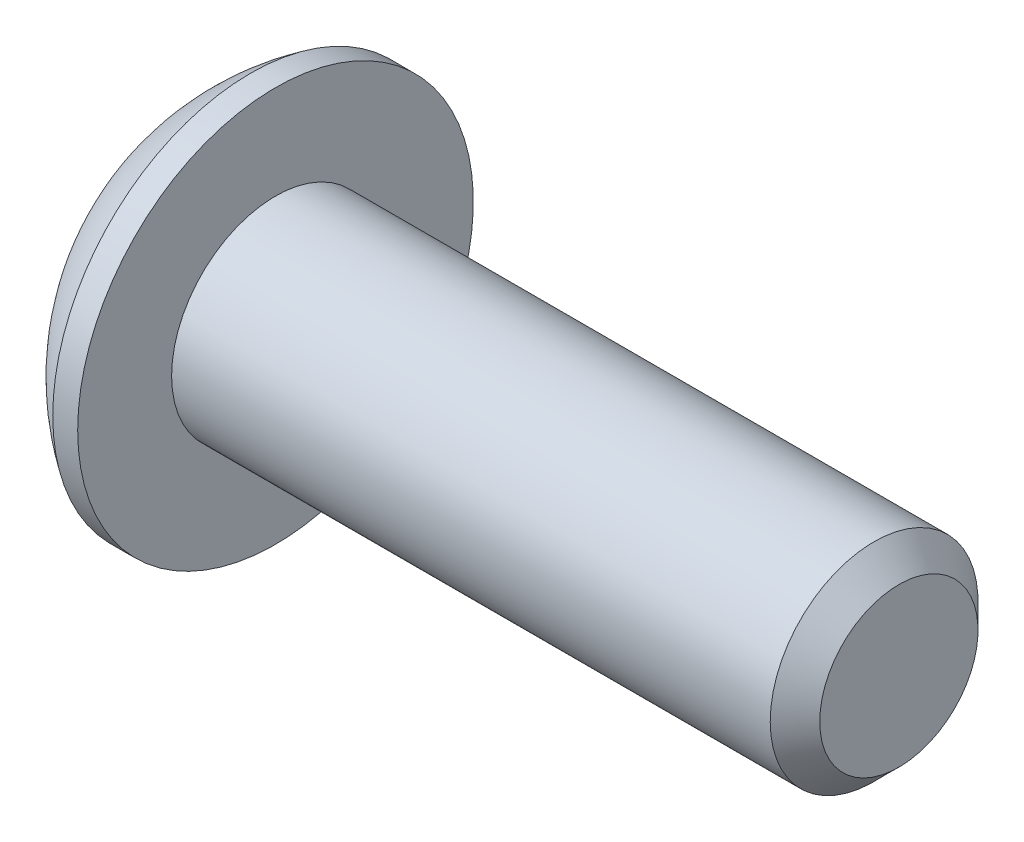
ISO-10303-21;
HEADER;
FILE_DESCRIPTION(('STEP AP214'),'2;1');
FILE_NAME('part.step','',(''),(''),'','','');
FILE_SCHEMA(('AUTOMOTIVE_DESIGN { 1 0 10303 214 1 1 1 1 }'));
ENDSEC;
DATA;
#1=APPLICATION_CONTEXT('core data for automotive mechanical design processes');
#2=APPLICATION_PROTOCOL_DEFINITION('international standard','automotive_design',2000,#1);
#3=PRODUCT_CONTEXT('',#1,'mechanical');
#4=PRODUCT('Part','Part','',(#3));
#5=PRODUCT_RELATED_PRODUCT_CATEGORY('part','',(#4));
#6=PRODUCT_DEFINITION_FORMATION('','',#4);
#7=PRODUCT_DEFINITION_CONTEXT('part definition',#1,'design');
#8=PRODUCT_DEFINITION('design','',#6,#7);
#9=PRODUCT_DEFINITION_SHAPE('','',#8);
#10=(LENGTH_UNIT() NAMED_UNIT(*) SI_UNIT(.MILLI.,.METRE.));
#11=(NAMED_UNIT(*) PLANE_ANGLE_UNIT() SI_UNIT($,.RADIAN.));
#12=(NAMED_UNIT(*) SI_UNIT($,.STERADIAN.) SOLID_ANGLE_UNIT());
#13=UNCERTAINTY_MEASURE_WITH_UNIT(LENGTH_MEASURE(1.E-05),#10,'distance_accuracy_value','');
#14=(GEOMETRIC_REPRESENTATION_CONTEXT(3) GLOBAL_UNCERTAINTY_ASSIGNED_CONTEXT((#13)) GLOBAL_UNIT_ASSIGNED_CONTEXT((#10,
#11,#12)) REPRESENTATION_CONTEXT('',''));
#15=CARTESIAN_POINT('',(0.,0.,0.));
#16=DIRECTION('',(0.,0.,1.));
#17=DIRECTION('',(1.,0.,0.));
#18=AXIS2_PLACEMENT_3D('',#15,#16,#17);
#19=CARTESIAN_POINT('',(0.,0.,0.));
#20=DIRECTION('',(-1.,0.,0.));
#21=DIRECTION('',(0.,0.,1.));
#22=AXIS2_PLACEMENT_3D('',#19,#20,#21);
#23=PLANE('',#22);
#24=CARTESIAN_POINT('',(0.,0.,0.));
#25=DIRECTION('',(-1.,0.,0.));
#26=DIRECTION('',(0.,0.,1.));
#27=AXIS2_PLACEMENT_3D('',#24,#25,#26);
#28=CIRCLE('',#27,1.5113);
#29=CARTESIAN_POINT('',(0.,1.5113,0.));
#30=VERTEX_POINT('',#29);
#31=EDGE_CURVE('E11',#30,#30,#28,.T.);
#32=ORIENTED_EDGE('',*,*,#31,.T.);
#33=EDGE_LOOP('',(#32));
#34=FACE_BOUND('',#33,.T.);
#35=DIRECTION('',(0.,-1.,0.));
#36=VECTOR('',#35,1.);
#37=CARTESIAN_POINT('',(0.,-0.571923176659242,0.9906));
#38=LINE('',#37,#36);
#39=CARTESIAN_POINT('',(0.,0.571923176659245,0.9906));
#40=VERTEX_POINT('',#39);
#41=CARTESIAN_POINT('',(0.,-0.571923176659242,0.9906));
#42=VERTEX_POINT('',#41);
#43=EDGE_CURVE('E47',#40,#42,#38,.T.);
#44=ORIENTED_EDGE('',*,*,#43,.T.);
#45=DIRECTION('',(0.,-0.5,-0.866025403784439));
#46=VECTOR('',#45,1.);
#47=CARTESIAN_POINT('',(0.,-1.14384635331848,0.));
#48=LINE('',#47,#46);
#49=CARTESIAN_POINT('',(0.,-1.14384635331848,0.));
#50=VERTEX_POINT('',#49);
#51=EDGE_CURVE('E368',#42,#50,#48,.T.);
#52=ORIENTED_EDGE('',*,*,#51,.T.);
#53=DIRECTION('',(0.,0.5,-0.866025403784439));
#54=VECTOR('',#53,1.);
#55=CARTESIAN_POINT('',(0.,-0.571923176659242,-0.9906));
#56=LINE('',#55,#54);
#57=CARTESIAN_POINT('',(0.,-0.571923176659242,-0.9906));
#58=VERTEX_POINT('',#57);
#59=EDGE_CURVE('E132',#50,#58,#56,.T.);
#60=ORIENTED_EDGE('',*,*,#59,.T.);
#61=DIRECTION('',(0.,1.,0.));
#62=VECTOR('',#61,1.);
#63=CARTESIAN_POINT('',(0.,0.571923176659245,-0.9906));
#64=LINE('',#63,#62);
#65=CARTESIAN_POINT('',(0.,0.571923176659245,-0.9906));
#66=VERTEX_POINT('',#65);
#67=EDGE_CURVE('E371',#58,#66,#64,.T.);
#68=ORIENTED_EDGE('',*,*,#67,.T.);
#69=DIRECTION('',(0.,0.5,0.866025403784439));
#70=VECTOR('',#69,1.);
#71=CARTESIAN_POINT('',(0.,1.14384635331849,0.));
#72=LINE('',#71,#70);
#73=CARTESIAN_POINT('',(0.,1.14384635331849,0.));
#74=VERTEX_POINT('',#73);
#75=EDGE_CURVE('E373',#66,#74,#72,.T.);
#76=ORIENTED_EDGE('',*,*,#75,.T.);
#77=DIRECTION('',(0.,-0.5,0.866025403784439));
#78=VECTOR('',#77,1.);
#79=CARTESIAN_POINT('',(0.,0.571923176659245,0.9906));
#80=LINE('',#79,#78);
#81=EDGE_CURVE('E375',#74,#40,#80,.T.);
#82=ORIENTED_EDGE('',*,*,#81,.T.);
#83=EDGE_LOOP('',(#44,#52,#60,#68,#76,#82));
#84=FACE_BOUND('',#83,.T.);
#85=ADVANCED_FACE('F33',(#34,#84),#23,.T.);
#86=CARTESIAN_POINT('',(3.292475,0.,0.));
#87=DIRECTION('',(-1.,0.,0.));
#88=DIRECTION('',(0.,1.,0.));
#89=AXIS2_PLACEMENT_3D('',#86,#87,#88);
#90=SPHERICAL_SURFACE('',#89,3.62276404360331);
#91=CARTESIAN_POINT('',(1.2954,0.,0.));
#92=DIRECTION('',(-1.,0.,0.));
#93=DIRECTION('',(0.,0.,1.));
#94=AXIS2_PLACEMENT_3D('',#91,#92,#93);
#95=CIRCLE('',#94,3.0226);
#96=CARTESIAN_POINT('',(1.2954,3.0226,0.));
#97=VERTEX_POINT('',#96);
#98=EDGE_CURVE('E40',#97,#97,#95,.T.);
#99=CARTESIAN_POINT('',(1.2954,3.0226,0.));
#100=CARTESIAN_POINT('',(1.27787522733781,3.01102115613242,0.));
#101=CARTESIAN_POINT('',(1.26045117643726,2.9992898696021,0.));
#102=CARTESIAN_POINT('',(1.22580974021955,2.97552603221306,0.));
#103=CARTESIAN_POINT('',(1.20859235490239,2.96349348135434,0.));
#104=CARTESIAN_POINT('',(1.1743694719116,2.93913073630554,0.));
#105=CARTESIAN_POINT('',(1.15736397423797,2.92680054211547,0.));
#106=CARTESIAN_POINT('',(1.12357000773801,2.90184624586994,0.));
#107=CARTESIAN_POINT('',(1.10678153891169,2.88922214381449,0.));
#108=CARTESIAN_POINT('',(1.07342671014046,2.86368384967757,0.));
#109=CARTESIAN_POINT('',(1.05686035019555,2.85076965759611,0.));
#110=CARTESIAN_POINT('',(1.02395475082294,2.82465509076211,0.));
#111=CARTESIAN_POINT('',(1.00761551139523,2.81145471600956,0.));
#112=CARTESIAN_POINT('',(0.975169096303361,2.78477177729852,0.));
#113=CARTESIAN_POINT('',(0.959061920639197,2.77128921334003,0.));
#114=CARTESIAN_POINT('',(0.927084506027184,2.74404597518,0.));
#115=CARTESIAN_POINT('',(0.911214267079337,2.73028530097846,0.));
#116=CARTESIAN_POINT('',(0.879715527194418,2.70249000539935,0.));
#117=CARTESIAN_POINT('',(0.864087026257346,2.68845538402179,0.));
#118=CARTESIAN_POINT('',(0.833076490548231,2.66011644004507,0.));
#119=CARTESIAN_POINT('',(0.817694455776187,2.64581211744592,0.));
#120=CARTESIAN_POINT('',(0.787181505988602,2.6169380985719,0.));
#121=CARTESIAN_POINT('',(0.772050590973061,2.60236840229702,0.));
#122=CARTESIAN_POINT('',(0.742044458317204,2.57296804390264,0.));
#123=CARTESIAN_POINT('',(0.727169240676889,2.55813738178315,0.));
#124=CARTESIAN_POINT('',(0.697679003033134,2.52821957848155,0.));
#125=CARTESIAN_POINT('',(0.683063983029694,2.51313243729945,0.));
#126=CARTESIAN_POINT('',(0.65409856220263,2.4827062402484,0.));
#127=CARTESIAN_POINT('',(0.639748161379007,2.46736718437944,0.));
#128=CARTESIAN_POINT('',(0.611316320398182,2.43644179854322,0.));
#129=CARTESIAN_POINT('',(0.597234880240981,2.42085546857595,0.));
#130=CARTESIAN_POINT('',(0.569345220709812,2.38944024994048,0.));
#131=CARTESIAN_POINT('',(0.555537001335844,2.3736113612723,0.));
#132=CARTESIAN_POINT('',(0.528197960829332,2.3417158140147,0.));
#133=CARTESIAN_POINT('',(0.514667139696788,2.32564915542529,0.));
#134=CARTESIAN_POINT('',(0.487886989208864,2.29328292903848,0.));
#135=CARTESIAN_POINT('',(0.474637659853484,2.27698336124107,0.));
#136=CARTESIAN_POINT('',(0.448424501294752,2.24415624761448,0.));
#137=CARTESIAN_POINT('',(0.4354606720914,2.22762870178529,0.));
#138=CARTESIAN_POINT('',(0.409822435838028,2.19435063224251,0.));
#139=CARTESIAN_POINT('',(0.397148028788009,2.1776001085289,0.));
#140=CARTESIAN_POINT('',(0.372092471282534,2.14388115082306,0.));
#141=CARTESIAN_POINT('',(0.359711320827078,2.12691271683083,0.));
#142=CARTESIAN_POINT('',(0.335246022231766,2.09276307209884,0.));
#143=CARTESIAN_POINT('',(0.323161874091911,2.07558186135909,0.));
#144=CARTESIAN_POINT('',(0.29929423599568,2.04101186103533,0.));
#145=CARTESIAN_POINT('',(0.287510746039305,2.02362307145133,0.));
#146=CARTESIAN_POINT('',(0.264247989217829,1.98864317414235,0.));
#147=CARTESIAN_POINT('',(0.252768722352729,1.97105206641738,0.));
#148=CARTESIAN_POINT('',(0.230117884586366,1.93567285473666,0.));
#149=CARTESIAN_POINT('',(0.218946313685103,1.9178847507809,0.));
#150=CARTESIAN_POINT('',(0.196914247620555,1.88211692815161,0.));
#151=CARTESIAN_POINT('',(0.18605375245727,1.86413720947808,0.));
#152=CARTESIAN_POINT('',(0.164647123568648,1.82799159687854,0.));
#153=CARTESIAN_POINT('',(0.154100989843312,1.80982570295254,0.));
#154=CARTESIAN_POINT('',(0.133326274287871,1.77331323570381,0.));
#155=CARTESIAN_POINT('',(0.123097692457766,1.7549666623811,0.));
#156=CARTESIAN_POINT('',(0.102961175593354,1.71809838660977,0.));
#157=CARTESIAN_POINT('',(0.0930532405590475,1.69957668416115,0.));
#158=CARTESIAN_POINT('',(0.0735610132634603,1.66236375431188,0.));
#159=CARTESIAN_POINT('',(0.06397672100218,1.64367252691122,0.));
#160=CARTESIAN_POINT('',(0.0451346844701974,1.60612619918345,0.));
#161=CARTESIAN_POINT('',(0.0358769401994951,1.58727109885633,0.));
#162=CARTESIAN_POINT('',(0.0176907793777413,1.54940273969933,0.));
#163=CARTESIAN_POINT('',(0.00876236282668983,1.53038948086944,0.));
#164=CARTESIAN_POINT('',(0.,1.5113,0.));
#165=B_SPLINE_CURVE_WITH_KNOTS('',3,(#99,#100,#101,#102,#103,#104,#105,#106,#107,#108,#109,#110,
#111,#112,#113,#114,#115,#116,#117,#118,#119,#120,#121,#122,#123,#124,#125,#126,#127,#128,#129,
#130,#131,#132,#133,#134,#135,#136,#137,#138,#139,#140,#141,#142,#143,#144,#145,#146,#147,#148,
#149,#150,#151,#152,#153,#154,#155,#156,#157,#158,#159,#160,#161,#162,#163,#164),.UNSPECIFIED.,
.F.,.F.,(4,2,2,2,2,2,2,2,2,2,2,2,2,2,2,2,2,2,2,2,2,2,2,2,2,2,2,2,2,2,2,2,4),(0.,
0.0630125805366063,0.126025161073213,0.189037741609819,0.252050322146426,0.315062902683032,
0.378075483219638,0.441088063756245,0.504100644292851,0.567113224829458,0.630125805366064,
0.69313838590267,0.756150966439277,0.819163546975884,0.88217612751249,0.945188708049097,
1.0082012885857,1.07121386912231,1.13422644965892,1.19723903019552,1.26025161073213,
1.32326419126874,1.38627677180534,1.44928935234195,1.51230193287855,1.57531451341516,
1.63832709395177,1.70133967448837,1.76435225502498,1.82736483556159,1.89037741609819,
1.9533899966348,2.01640257717141),.UNSPECIFIED.);
#166=EDGE_CURVE('BSEAM159',#97,#30,#165,.T.);
#167=ORIENTED_EDGE('',*,*,#98,.T.);
#168=ORIENTED_EDGE('',*,*,#31,.F.);
#169=ORIENTED_EDGE('',*,*,#166,.T.);
#170=ORIENTED_EDGE('',*,*,#166,.F.);
#171=EDGE_LOOP('',(#167,#169,#168,#170));
#172=FACE_BOUND('',#171,.T.);
#173=ADVANCED_FACE('F159',(#172),#90,.T.);
#174=CARTESIAN_POINT('',(0.,0.,0.));
#175=DIRECTION('',(-1.,0.,0.));
#176=DIRECTION('',(0.,0.,1.));
#177=AXIS2_PLACEMENT_3D('',#174,#175,#176);
#178=CYLINDRICAL_SURFACE('',#177,3.0226);
#179=ORIENTED_EDGE('',*,*,#98,.F.);
#180=EDGE_LOOP('',(#179));
#181=FACE_BOUND('',#180,.T.);
#182=CARTESIAN_POINT('',(1.6764,0.,0.));
#183=DIRECTION('',(-1.,0.,0.));
#184=DIRECTION('',(0.,0.,1.));
#185=AXIS2_PLACEMENT_3D('',#182,#183,#184);
#186=CIRCLE('',#185,3.0226);
#187=CARTESIAN_POINT('',(1.6764,0.,3.0226));
#188=VERTEX_POINT('',#187);
#189=EDGE_CURVE('E154',#188,#188,#186,.T.);
#190=ORIENTED_EDGE('',*,*,#189,.T.);
#191=EDGE_LOOP('',(#190));
#192=FACE_BOUND('',#191,.T.);
#193=ADVANCED_FACE('F162',(#181,#192),#178,.T.);
#194=CARTESIAN_POINT('',(1.6764,1.5875,0.));
#195=DIRECTION('',(-1.,0.,0.));
#196=DIRECTION('',(0.,0.,1.));
#197=AXIS2_PLACEMENT_3D('',#194,#195,#196);
#198=PLANE('',#197);
#199=ORIENTED_EDGE('',*,*,#189,.F.);
#200=EDGE_LOOP('',(#199));
#201=FACE_BOUND('',#200,.T.);
#202=CARTESIAN_POINT('',(1.6764,0.,0.));
#203=DIRECTION('',(-1.,0.,0.));
#204=DIRECTION('',(0.,0.,1.));
#205=AXIS2_PLACEMENT_3D('',#202,#203,#204);
#206=CIRCLE('',#205,1.5875);
#207=CARTESIAN_POINT('',(1.6764,0.,1.5875));
#208=VERTEX_POINT('',#207);
#209=EDGE_CURVE('E151',#208,#208,#206,.T.);
#210=ORIENTED_EDGE('',*,*,#209,.T.);
#211=EDGE_LOOP('',(#210));
#212=FACE_BOUND('',#211,.T.);
#213=ADVANCED_FACE('F165',(#201,#212),#198,.F.);
#214=CARTESIAN_POINT('',(0.,0.,0.));
#215=DIRECTION('',(-1.,0.,0.));
#216=DIRECTION('',(0.,0.,1.));
#217=AXIS2_PLACEMENT_3D('',#214,#215,#216);
#218=CYLINDRICAL_SURFACE('',#217,1.5875);
#219=ORIENTED_EDGE('',*,*,#209,.F.);
#220=EDGE_LOOP('',(#219));
#221=FACE_BOUND('',#220,.T.);
#222=CARTESIAN_POINT('',(10.82294,0.,0.));
#223=DIRECTION('',(-1.,0.,0.));
#224=DIRECTION('',(0.,0.,1.));
#225=AXIS2_PLACEMENT_3D('',#222,#223,#224);
#226=CIRCLE('',#225,1.5875);
#227=CARTESIAN_POINT('',(10.82294,0.,1.5875));
#228=VERTEX_POINT('',#227);
#229=EDGE_CURVE('E148',#228,#228,#226,.T.);
#230=ORIENTED_EDGE('',*,*,#229,.T.);
#231=EDGE_LOOP('',(#230));
#232=FACE_BOUND('',#231,.T.);
#233=ADVANCED_FACE('F171',(#221,#232),#218,.T.);
#234=CARTESIAN_POINT('',(11.2014,0.,0.));
#235=DIRECTION('',(-1.,0.,0.));
#236=DIRECTION('',(0.,0.,1.));
#237=AXIS2_PLACEMENT_3D('',#234,#235,#236);
#238=CONICAL_SURFACE('',#237,1.20904,0.785398163397448);
#239=ORIENTED_EDGE('',*,*,#229,.F.);
#240=EDGE_LOOP('',(#239));
#241=FACE_BOUND('',#240,.T.);
#242=CARTESIAN_POINT('',(11.2014,0.,0.));
#243=DIRECTION('',(-1.,0.,0.));
#244=DIRECTION('',(0.,0.,1.));
#245=AXIS2_PLACEMENT_3D('',#242,#243,#244);
#246=CIRCLE('',#245,1.20904);
#247=CARTESIAN_POINT('',(11.2014,0.,1.20904));
#248=VERTEX_POINT('',#247);
#249=EDGE_CURVE('E144',#248,#248,#246,.T.);
#250=ORIENTED_EDGE('',*,*,#249,.T.);
#251=EDGE_LOOP('',(#250));
#252=FACE_BOUND('',#251,.T.);
#253=ADVANCED_FACE('F177',(#241,#252),#238,.T.);
#254=CARTESIAN_POINT('',(11.2014,0.,0.));
#255=DIRECTION('',(-1.,0.,0.));
#256=DIRECTION('',(0.,0.,1.));
#257=AXIS2_PLACEMENT_3D('',#254,#255,#256);
#258=PLANE('',#257);
#259=ORIENTED_EDGE('',*,*,#249,.F.);
#260=EDGE_LOOP('',(#259));
#261=FACE_BOUND('',#260,.T.);
#262=ADVANCED_FACE('F183',(#261),#258,.F.);
#263=CARTESIAN_POINT('',(1.1176,-1.14384635331848,0.));
#264=DIRECTION('',(0.,0.866025403784439,-0.5));
#265=DIRECTION('',(0.,0.5,0.866025403784439));
#266=AXIS2_PLACEMENT_3D('',#263,#264,#265);
#267=PLANE('',#266);
#268=DIRECTION('',(0.,-0.5,-0.866025403784439));
#269=VECTOR('',#268,1.);
#270=CARTESIAN_POINT('',(1.1176,-1.14384635331848,0.));
#271=LINE('',#270,#269);
#272=CARTESIAN_POINT('',(1.1176,-0.571923176659242,0.9906));
#273=VERTEX_POINT('',#272);
#274=CARTESIAN_POINT('',(1.1176,-0.857884764988864,0.495299999999999));
#275=VERTEX_POINT('',#274);
#276=EDGE_CURVE('E115',#273,#275,#271,.T.);
#277=ORIENTED_EDGE('',*,*,#276,.T.);
#278=CARTESIAN_POINT('',(1.1176,-1.14384635331848,0.));
#279=VERTEX_POINT('',#278);
#280=EDGE_CURVE('E108',#275,#279,#271,.T.);
#281=ORIENTED_EDGE('',*,*,#280,.T.);
#282=DIRECTION('',(-1.,0.,0.));
#283=VECTOR('',#282,1.);
#284=CARTESIAN_POINT('',(1.1176,-1.14384635331848,0.));
#285=LINE('',#284,#283);
#286=EDGE_CURVE('E112',#279,#50,#285,.T.);
#287=ORIENTED_EDGE('',*,*,#286,.T.);
#288=ORIENTED_EDGE('',*,*,#51,.F.);
#289=DIRECTION('',(-1.,0.,0.));
#290=VECTOR('',#289,1.);
#291=CARTESIAN_POINT('',(1.1176,-0.571923176659242,0.9906));
#292=LINE('',#291,#290);
#293=EDGE_CURVE('E367',#273,#42,#292,.T.);
#294=ORIENTED_EDGE('',*,*,#293,.F.);
#295=EDGE_LOOP('',(#277,#281,#287,#288,#294));
#296=FACE_BOUND('',#295,.T.);
#297=ADVANCED_FACE('F110',(#296),#267,.T.);
#298=CARTESIAN_POINT('',(1.1176,-0.571923176659242,-0.9906));
#299=DIRECTION('',(0.,0.866025403784439,0.5));
#300=DIRECTION('',(0.,-0.5,0.866025403784439));
#301=AXIS2_PLACEMENT_3D('',#298,#299,#300);
#302=PLANE('',#301);
#303=DIRECTION('',(0.,0.5,-0.866025403784439));
#304=VECTOR('',#303,1.);
#305=CARTESIAN_POINT('',(1.1176,-0.571923176659242,-0.9906));
#306=LINE('',#305,#304);
#307=CARTESIAN_POINT('',(1.1176,-0.857884764988864,-0.495299999999999));
#308=VERTEX_POINT('',#307);
#309=EDGE_CURVE('E120',#279,#308,#306,.T.);
#310=ORIENTED_EDGE('',*,*,#309,.T.);
#311=CARTESIAN_POINT('',(1.1176,-0.571923176659242,-0.9906));
#312=VERTEX_POINT('',#311);
#313=EDGE_CURVE('E127',#308,#312,#306,.T.);
#314=ORIENTED_EDGE('',*,*,#313,.T.);
#315=DIRECTION('',(-1.,0.,0.));
#316=VECTOR('',#315,1.);
#317=CARTESIAN_POINT('',(1.1176,-0.571923176659242,-0.9906));
#318=LINE('',#317,#316);
#319=EDGE_CURVE('E134',#312,#58,#318,.T.);
#320=ORIENTED_EDGE('',*,*,#319,.T.);
#321=ORIENTED_EDGE('',*,*,#59,.F.);
#322=ORIENTED_EDGE('',*,*,#286,.F.);
#323=EDGE_LOOP('',(#310,#314,#320,#321,#322));
#324=FACE_BOUND('',#323,.T.);
#325=ADVANCED_FACE('F130',(#324),#302,.T.);
#326=CARTESIAN_POINT('',(1.1176,0.571923176659245,-0.9906));
#327=DIRECTION('',(0.,0.,1.));
#328=DIRECTION('',(1.,0.,0.));
#329=AXIS2_PLACEMENT_3D('',#326,#327,#328);
#330=PLANE('',#329);
#331=DIRECTION('',(0.,1.,0.));
#332=VECTOR('',#331,1.);
#333=CARTESIAN_POINT('',(1.1176,0.571923176659245,-0.9906));
#334=LINE('',#333,#332);
#335=CARTESIAN_POINT('',(1.1176,0.,-0.9906));
#336=VERTEX_POINT('',#335);
#337=EDGE_CURVE('E392',#312,#336,#334,.T.);
#338=ORIENTED_EDGE('',*,*,#337,.T.);
#339=CARTESIAN_POINT('',(1.1176,0.571923176659245,-0.9906));
#340=VERTEX_POINT('',#339);
#341=EDGE_CURVE('E126',#336,#340,#334,.T.);
#342=ORIENTED_EDGE('',*,*,#341,.T.);
#343=DIRECTION('',(-1.,0.,0.));
#344=VECTOR('',#343,1.);
#345=CARTESIAN_POINT('',(1.1176,0.571923176659245,-0.9906));
#346=LINE('',#345,#344);
#347=EDGE_CURVE('E139',#340,#66,#346,.T.);
#348=ORIENTED_EDGE('',*,*,#347,.T.);
#349=ORIENTED_EDGE('',*,*,#67,.F.);
#350=ORIENTED_EDGE('',*,*,#319,.F.);
#351=EDGE_LOOP('',(#338,#342,#348,#349,#350));
#352=FACE_BOUND('',#351,.T.);
#353=ADVANCED_FACE('F242',(#352),#330,.T.);
#354=CARTESIAN_POINT('',(1.1176,1.14384635331849,0.));
#355=DIRECTION('',(0.,-0.866025403784439,0.5));
#356=DIRECTION('',(0.,-0.5,-0.866025403784439));
#357=AXIS2_PLACEMENT_3D('',#354,#355,#356);
#358=PLANE('',#357);
#359=DIRECTION('',(0.,0.5,0.866025403784439));
#360=VECTOR('',#359,1.);
#361=CARTESIAN_POINT('',(1.1176,1.14384635331849,0.));
#362=LINE('',#361,#360);
#363=CARTESIAN_POINT('',(1.1176,0.857884764988866,-0.495300000000001));
#364=VERTEX_POINT('',#363);
#365=EDGE_CURVE('E354',#340,#364,#362,.T.);
#366=ORIENTED_EDGE('',*,*,#365,.T.);
#367=CARTESIAN_POINT('',(1.1176,1.14384635331849,0.));
#368=VERTEX_POINT('',#367);
#369=EDGE_CURVE('E394',#364,#368,#362,.T.);
#370=ORIENTED_EDGE('',*,*,#369,.T.);
#371=DIRECTION('',(-1.,0.,0.));
#372=VECTOR('',#371,1.);
#373=CARTESIAN_POINT('',(1.1176,1.14384635331849,0.));
#374=LINE('',#373,#372);
#375=EDGE_CURVE('E360',#368,#74,#374,.T.);
#376=ORIENTED_EDGE('',*,*,#375,.T.);
#377=ORIENTED_EDGE('',*,*,#75,.F.);
#378=ORIENTED_EDGE('',*,*,#347,.F.);
#379=EDGE_LOOP('',(#366,#370,#376,#377,#378));
#380=FACE_BOUND('',#379,.T.);
#381=ADVANCED_FACE('F251',(#380),#358,.T.);
#382=CARTESIAN_POINT('',(1.1176,0.571923176659245,0.9906));
#383=DIRECTION('',(0.,-0.866025403784439,-0.5));
#384=DIRECTION('',(0.,0.5,-0.866025403784439));
#385=AXIS2_PLACEMENT_3D('',#382,#383,#384);
#386=PLANE('',#385);
#387=DIRECTION('',(0.,-0.5,0.866025403784439));
#388=VECTOR('',#387,1.);
#389=CARTESIAN_POINT('',(1.1176,0.571923176659245,0.9906));
#390=LINE('',#389,#388);
#391=CARTESIAN_POINT('',(1.1176,0.857884764988866,0.495300000000001));
#392=VERTEX_POINT('',#391);
#393=EDGE_CURVE('E353',#368,#392,#390,.T.);
#394=ORIENTED_EDGE('',*,*,#393,.T.);
#395=CARTESIAN_POINT('',(1.1176,0.571923176659245,0.9906));
#396=VERTEX_POINT('',#395);
#397=EDGE_CURVE('E350',#392,#396,#390,.T.);
#398=ORIENTED_EDGE('',*,*,#397,.T.);
#399=DIRECTION('',(-1.,0.,0.));
#400=VECTOR('',#399,1.);
#401=CARTESIAN_POINT('',(1.1176,0.571923176659245,0.9906));
#402=LINE('',#401,#400);
#403=EDGE_CURVE('E380',#396,#40,#402,.T.);
#404=ORIENTED_EDGE('',*,*,#403,.T.);
#405=ORIENTED_EDGE('',*,*,#81,.F.);
#406=ORIENTED_EDGE('',*,*,#375,.F.);
#407=EDGE_LOOP('',(#394,#398,#404,#405,#406));
#408=FACE_BOUND('',#407,.T.);
#409=ADVANCED_FACE('F261',(#408),#386,.T.);
#410=CARTESIAN_POINT('',(1.1176,-0.571923176659242,0.9906));
#411=DIRECTION('',(0.,0.,-1.));
#412=DIRECTION('',(-1.,0.,0.));
#413=AXIS2_PLACEMENT_3D('',#410,#411,#412);
#414=PLANE('',#413);
#415=DIRECTION('',(0.,-1.,0.));
#416=VECTOR('',#415,1.);
#417=CARTESIAN_POINT('',(1.1176,-0.571923176659242,0.9906));
#418=LINE('',#417,#416);
#419=CARTESIAN_POINT('',(1.1176,0.,0.9906));
#420=VERTEX_POINT('',#419);
#421=EDGE_CURVE('E55',#396,#420,#418,.T.);
#422=ORIENTED_EDGE('',*,*,#421,.T.);
#423=EDGE_CURVE('E362',#420,#273,#418,.T.);
#424=ORIENTED_EDGE('',*,*,#423,.T.);
#425=ORIENTED_EDGE('',*,*,#293,.T.);
#426=ORIENTED_EDGE('',*,*,#43,.F.);
#427=ORIENTED_EDGE('',*,*,#403,.F.);
#428=EDGE_LOOP('',(#422,#424,#425,#426,#427));
#429=FACE_BOUND('',#428,.T.);
#430=ADVANCED_FACE('F271',(#429),#414,.T.);
#431=CARTESIAN_POINT('',(1.1176,-0.571923176659242,0.9906));
#432=DIRECTION('',(-1.,0.,0.));
#433=DIRECTION('',(0.,0.,1.));
#434=AXIS2_PLACEMENT_3D('',#431,#432,#433);
#435=PLANE('',#434);
#436=ORIENTED_EDGE('',*,*,#421,.F.);
#437=ORIENTED_EDGE('',*,*,#397,.F.);
#438=CARTESIAN_POINT('',(1.1176,0.,0.));
#439=DIRECTION('',(-1.,0.,0.));
#440=DIRECTION('',(0.,0.,1.));
#441=AXIS2_PLACEMENT_3D('',#438,#439,#440);
#442=CIRCLE('',#441,0.9906);
#443=EDGE_CURVE('E138',#420,#392,#442,.T.);
#444=ORIENTED_EDGE('',*,*,#443,.F.);
#445=EDGE_LOOP('',(#436,#437,#444));
#446=FACE_BOUND('',#445,.T.);
#447=ADVANCED_FACE('F281',(#446),#435,.T.);
#448=ORIENTED_EDGE('',*,*,#393,.F.);
#449=ORIENTED_EDGE('',*,*,#369,.F.);
#450=EDGE_CURVE('E145',#392,#364,#442,.T.);
#451=ORIENTED_EDGE('',*,*,#450,.F.);
#452=EDGE_LOOP('',(#448,#449,#451));
#453=FACE_BOUND('',#452,.T.);
#454=ADVANCED_FACE('F290',(#453),#435,.T.);
#455=ORIENTED_EDGE('',*,*,#365,.F.);
#456=ORIENTED_EDGE('',*,*,#341,.F.);
#457=EDGE_CURVE('E395',#364,#336,#442,.T.);
#458=ORIENTED_EDGE('',*,*,#457,.F.);
#459=EDGE_LOOP('',(#455,#456,#458));
#460=FACE_BOUND('',#459,.T.);
#461=ADVANCED_FACE('F301',(#460),#435,.T.);
#462=ORIENTED_EDGE('',*,*,#337,.F.);
#463=ORIENTED_EDGE('',*,*,#313,.F.);
#464=EDGE_CURVE('E393',#336,#308,#442,.T.);
#465=ORIENTED_EDGE('',*,*,#464,.F.);
#466=EDGE_LOOP('',(#462,#463,#465));
#467=FACE_BOUND('',#466,.T.);
#468=ADVANCED_FACE('F310',(#467),#435,.T.);
#469=ORIENTED_EDGE('',*,*,#309,.F.);
#470=ORIENTED_EDGE('',*,*,#280,.F.);
#471=EDGE_CURVE('E122',#308,#275,#442,.T.);
#472=ORIENTED_EDGE('',*,*,#471,.F.);
#473=EDGE_LOOP('',(#469,#470,#472));
#474=FACE_BOUND('',#473,.T.);
#475=ADVANCED_FACE('F121',(#474),#435,.T.);
#476=ORIENTED_EDGE('',*,*,#276,.F.);
#477=ORIENTED_EDGE('',*,*,#423,.F.);
#478=EDGE_CURVE('E133',#275,#420,#442,.T.);
#479=ORIENTED_EDGE('',*,*,#478,.F.);
#480=EDGE_LOOP('',(#476,#477,#479));
#481=FACE_BOUND('',#480,.T.);
#482=ADVANCED_FACE('F293',(#481),#435,.T.);
#483=CARTESIAN_POINT('',(1.68952317665925,0.,0.));
#484=DIRECTION('',(-1.,0.,0.));
#485=DIRECTION('',(0.,0.,1.));
#486=AXIS2_PLACEMENT_3D('',#483,#484,#485);
#487=CONICAL_SURFACE('',#486,0.,1.04719755119659);
#488=ORIENTED_EDGE('',*,*,#443,.T.);
#489=ORIENTED_EDGE('',*,*,#450,.T.);
#490=ORIENTED_EDGE('',*,*,#457,.T.);
#491=ORIENTED_EDGE('',*,*,#464,.T.);
#492=ORIENTED_EDGE('',*,*,#471,.T.);
#493=ORIENTED_EDGE('',*,*,#478,.T.);
#494=EDGE_LOOP('',(#488,#489,#490,#491,#492,#493));
#495=FACE_BOUND('',#494,.T.);
#496=CARTESIAN_POINT('',(1.68952317665925,0.,0.));
#497=VERTEX_POINT('',#496);
#498=VERTEX_LOOP('',#497);
#499=FACE_BOUND('',#498,.T.);
#500=ADVANCED_FACE('F334',(#495,#499),#487,.F.);
#501=CLOSED_SHELL('',(#85,#173,#193,#213,#233,#253,#262,#297,#325,#353,#381,#409,#430,#447,#454,
#461,#468,#475,#482,#500));
#502=MANIFOLD_SOLID_BREP('B2',#501);
#503=ADVANCED_BREP_SHAPE_REPRESENTATION('',(#18,#502),#14);
#504=SHAPE_DEFINITION_REPRESENTATION(#9,#503);
ENDSEC;
END-ISO-10303-21;
